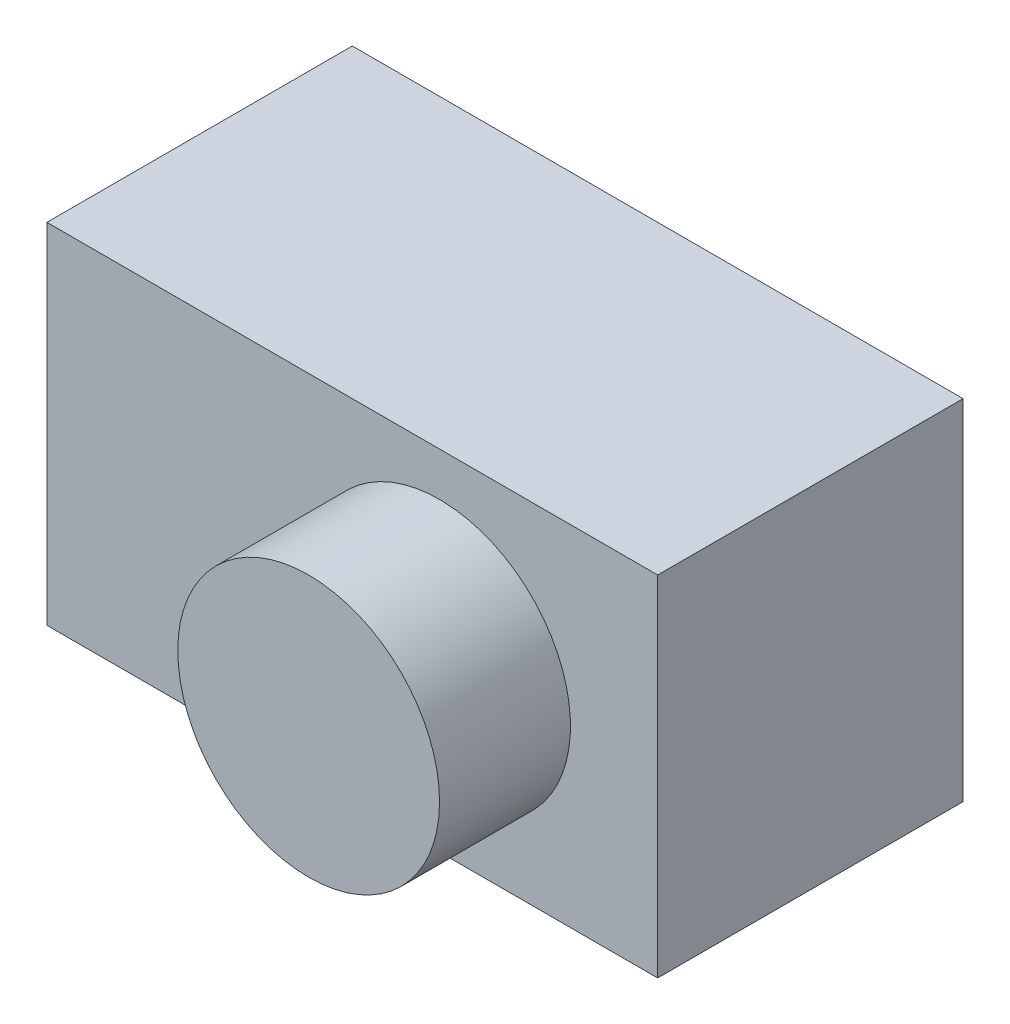
ISO-10303-21;
HEADER;
FILE_DESCRIPTION(('STEP AP214'),'2;1');
FILE_NAME('part.step','',(''),(''),'','','');
FILE_SCHEMA(('AUTOMOTIVE_DESIGN { 1 0 10303 214 1 1 1 1 }'));
ENDSEC;
DATA;
#1=APPLICATION_CONTEXT('core data for automotive mechanical design processes');
#2=APPLICATION_PROTOCOL_DEFINITION('international standard','automotive_design',2000,#1);
#3=PRODUCT_CONTEXT('',#1,'mechanical');
#4=PRODUCT('Part','Part','',(#3));
#5=PRODUCT_RELATED_PRODUCT_CATEGORY('part','',(#4));
#6=PRODUCT_DEFINITION_FORMATION('','',#4);
#7=PRODUCT_DEFINITION_CONTEXT('part definition',#1,'design');
#8=PRODUCT_DEFINITION('design','',#6,#7);
#9=PRODUCT_DEFINITION_SHAPE('','',#8);
#10=(LENGTH_UNIT() NAMED_UNIT(*) SI_UNIT(.MILLI.,.METRE.));
#11=(NAMED_UNIT(*) PLANE_ANGLE_UNIT() SI_UNIT($,.RADIAN.));
#12=(NAMED_UNIT(*) SI_UNIT($,.STERADIAN.) SOLID_ANGLE_UNIT());
#13=UNCERTAINTY_MEASURE_WITH_UNIT(LENGTH_MEASURE(1.E-05),#10,'distance_accuracy_value','');
#14=(GEOMETRIC_REPRESENTATION_CONTEXT(3) GLOBAL_UNCERTAINTY_ASSIGNED_CONTEXT((#13)) GLOBAL_UNIT_ASSIGNED_CONTEXT((#10,
#11,#12)) REPRESENTATION_CONTEXT('',''));
#15=CARTESIAN_POINT('',(0.,0.,0.));
#16=DIRECTION('',(0.,0.,1.));
#17=DIRECTION('',(1.,0.,0.));
#18=AXIS2_PLACEMENT_3D('',#15,#16,#17);
#19=CARTESIAN_POINT('',(0.,0.,70.));
#20=DIRECTION('',(1.,0.,0.));
#21=DIRECTION('',(0.,0.,-1.));
#22=AXIS2_PLACEMENT_3D('',#19,#20,#21);
#23=PLANE('',#22);
#24=DIRECTION('',(0.,-1.,0.));
#25=VECTOR('',#24,1.);
#26=CARTESIAN_POINT('',(0.,0.,0.));
#27=LINE('',#26,#25);
#28=CARTESIAN_POINT('',(0.,80.,0.));
#29=VERTEX_POINT('',#28);
#30=CARTESIAN_POINT('',(0.,0.,0.));
#31=VERTEX_POINT('',#30);
#32=EDGE_CURVE('E122',#29,#31,#27,.T.);
#33=ORIENTED_EDGE('',*,*,#32,.T.);
#34=DIRECTION('',(0.,0.,-1.));
#35=VECTOR('',#34,1.);
#36=CARTESIAN_POINT('',(0.,0.,70.));
#37=LINE('',#36,#35);
#38=CARTESIAN_POINT('',(0.,0.,70.));
#39=VERTEX_POINT('',#38);
#40=EDGE_CURVE('E60',#39,#31,#37,.T.);
#41=ORIENTED_EDGE('',*,*,#40,.F.);
#42=DIRECTION('',(0.,-1.,0.));
#43=VECTOR('',#42,1.);
#44=CARTESIAN_POINT('',(0.,0.,70.));
#45=LINE('',#44,#43);
#46=CARTESIAN_POINT('',(0.,80.,70.));
#47=VERTEX_POINT('',#46);
#48=EDGE_CURVE('E104',#47,#39,#45,.T.);
#49=ORIENTED_EDGE('',*,*,#48,.F.);
#50=DIRECTION('',(0.,0.,-1.));
#51=VECTOR('',#50,1.);
#52=CARTESIAN_POINT('',(0.,80.,70.));
#53=LINE('',#52,#51);
#54=EDGE_CURVE('E118',#47,#29,#53,.T.);
#55=ORIENTED_EDGE('',*,*,#54,.T.);
#56=EDGE_LOOP('',(#33,#41,#49,#55));
#57=FACE_BOUND('',#56,.T.);
#58=ADVANCED_FACE('F51',(#57),#23,.F.);
#59=CARTESIAN_POINT('',(0.,0.,70.));
#60=DIRECTION('',(0.,1.,0.));
#61=DIRECTION('',(0.,0.,1.));
#62=AXIS2_PLACEMENT_3D('',#59,#60,#61);
#63=PLANE('',#62);
#64=DIRECTION('',(1.,0.,0.));
#65=VECTOR('',#64,1.);
#66=CARTESIAN_POINT('',(0.,0.,0.));
#67=LINE('',#66,#65);
#68=CARTESIAN_POINT('',(140.,0.,0.));
#69=VERTEX_POINT('',#68);
#70=EDGE_CURVE('E110',#31,#69,#67,.T.);
#71=ORIENTED_EDGE('',*,*,#70,.T.);
#72=DIRECTION('',(0.,0.,-1.));
#73=VECTOR('',#72,1.);
#74=CARTESIAN_POINT('',(140.,0.,70.));
#75=LINE('',#74,#73);
#76=CARTESIAN_POINT('',(140.,0.,70.));
#77=VERTEX_POINT('',#76);
#78=EDGE_CURVE('E108',#77,#69,#75,.T.);
#79=ORIENTED_EDGE('',*,*,#78,.F.);
#80=DIRECTION('',(1.,0.,0.));
#81=VECTOR('',#80,1.);
#82=CARTESIAN_POINT('',(0.,0.,70.));
#83=LINE('',#82,#81);
#84=EDGE_CURVE('E99',#39,#77,#83,.T.);
#85=ORIENTED_EDGE('',*,*,#84,.F.);
#86=ORIENTED_EDGE('',*,*,#40,.T.);
#87=EDGE_LOOP('',(#71,#79,#85,#86));
#88=FACE_BOUND('',#87,.T.);
#89=ADVANCED_FACE('F109',(#88),#63,.F.);
#90=CARTESIAN_POINT('',(140.,0.,70.));
#91=DIRECTION('',(-1.,0.,0.));
#92=DIRECTION('',(0.,0.,1.));
#93=AXIS2_PLACEMENT_3D('',#90,#91,#92);
#94=PLANE('',#93);
#95=DIRECTION('',(0.,1.,0.));
#96=VECTOR('',#95,1.);
#97=CARTESIAN_POINT('',(140.,0.,0.));
#98=LINE('',#97,#96);
#99=CARTESIAN_POINT('',(140.,80.,0.));
#100=VERTEX_POINT('',#99);
#101=EDGE_CURVE('E85',#69,#100,#98,.T.);
#102=ORIENTED_EDGE('',*,*,#101,.T.);
#103=DIRECTION('',(0.,0.,-1.));
#104=VECTOR('',#103,1.);
#105=CARTESIAN_POINT('',(140.,80.,70.));
#106=LINE('',#105,#104);
#107=CARTESIAN_POINT('',(140.,80.,70.));
#108=VERTEX_POINT('',#107);
#109=EDGE_CURVE('E112',#108,#100,#106,.T.);
#110=ORIENTED_EDGE('',*,*,#109,.F.);
#111=DIRECTION('',(0.,1.,0.));
#112=VECTOR('',#111,1.);
#113=CARTESIAN_POINT('',(140.,0.,70.));
#114=LINE('',#113,#112);
#115=EDGE_CURVE('E102',#77,#108,#114,.T.);
#116=ORIENTED_EDGE('',*,*,#115,.F.);
#117=ORIENTED_EDGE('',*,*,#78,.T.);
#118=EDGE_LOOP('',(#102,#110,#116,#117));
#119=FACE_BOUND('',#118,.T.);
#120=ADVANCED_FACE('F114',(#119),#94,.F.);
#121=CARTESIAN_POINT('',(0.,80.,70.));
#122=DIRECTION('',(0.,-1.,0.));
#123=DIRECTION('',(0.,0.,-1.));
#124=AXIS2_PLACEMENT_3D('',#121,#122,#123);
#125=PLANE('',#124);
#126=DIRECTION('',(-1.,0.,0.));
#127=VECTOR('',#126,1.);
#128=CARTESIAN_POINT('',(0.,80.,0.));
#129=LINE('',#128,#127);
#130=EDGE_CURVE('E91',#100,#29,#129,.T.);
#131=ORIENTED_EDGE('',*,*,#130,.T.);
#132=ORIENTED_EDGE('',*,*,#54,.F.);
#133=DIRECTION('',(-1.,0.,0.));
#134=VECTOR('',#133,1.);
#135=CARTESIAN_POINT('',(0.,80.,70.));
#136=LINE('',#135,#134);
#137=EDGE_CURVE('E68',#108,#47,#136,.T.);
#138=ORIENTED_EDGE('',*,*,#137,.F.);
#139=ORIENTED_EDGE('',*,*,#109,.T.);
#140=EDGE_LOOP('',(#131,#132,#138,#139));
#141=FACE_BOUND('',#140,.T.);
#142=ADVANCED_FACE('F151',(#141),#125,.F.);
#143=CARTESIAN_POINT('',(0.,0.,70.));
#144=DIRECTION('',(0.,0.,-1.));
#145=DIRECTION('',(-1.,0.,0.));
#146=AXIS2_PLACEMENT_3D('',#143,#144,#145);
#147=PLANE('',#146);
#148=CARTESIAN_POINT('',(90.,40.,70.));
#149=DIRECTION('',(0.,0.,-1.));
#150=DIRECTION('',(-1.,0.,0.));
#151=AXIS2_PLACEMENT_3D('',#148,#149,#150);
#152=CIRCLE('',#151,30.);
#153=CARTESIAN_POINT('',(60.,40.,70.));
#154=VERTEX_POINT('',#153);
#155=EDGE_CURVE('E11',#154,#154,#152,.F.);
#156=ORIENTED_EDGE('',*,*,#155,.F.);
#157=EDGE_LOOP('',(#156));
#158=FACE_BOUND('',#157,.T.);
#159=ORIENTED_EDGE('',*,*,#48,.T.);
#160=ORIENTED_EDGE('',*,*,#84,.T.);
#161=ORIENTED_EDGE('',*,*,#115,.T.);
#162=ORIENTED_EDGE('',*,*,#137,.T.);
#163=EDGE_LOOP('',(#159,#160,#161,#162));
#164=FACE_BOUND('',#163,.T.);
#165=ADVANCED_FACE('F100',(#158,#164),#147,.F.);
#166=CARTESIAN_POINT('',(0.,0.,0.));
#167=DIRECTION('',(0.,0.,-1.));
#168=DIRECTION('',(-1.,0.,0.));
#169=AXIS2_PLACEMENT_3D('',#166,#167,#168);
#170=PLANE('',#169);
#171=ORIENTED_EDGE('',*,*,#32,.F.);
#172=ORIENTED_EDGE('',*,*,#130,.F.);
#173=ORIENTED_EDGE('',*,*,#101,.F.);
#174=ORIENTED_EDGE('',*,*,#70,.F.);
#175=EDGE_LOOP('',(#171,#172,#173,#174));
#176=FACE_BOUND('',#175,.T.);
#177=ADVANCED_FACE('F140',(#176),#170,.T.);
#178=CARTESIAN_POINT('',(90.,40.,100.));
#179=DIRECTION('',(0.,0.,-1.));
#180=DIRECTION('',(-1.,0.,0.));
#181=AXIS2_PLACEMENT_3D('',#178,#179,#180);
#182=CYLINDRICAL_SURFACE('',#181,30.);
#183=CARTESIAN_POINT('',(90.,40.,100.));
#184=DIRECTION('',(0.,0.,1.));
#185=DIRECTION('',(1.,0.,0.));
#186=AXIS2_PLACEMENT_3D('',#183,#184,#185);
#187=CIRCLE('',#186,30.);
#188=CARTESIAN_POINT('',(120.,40.,100.));
#189=VERTEX_POINT('',#188);
#190=EDGE_CURVE('E126',#189,#189,#187,.T.);
#191=ORIENTED_EDGE('',*,*,#190,.F.);
#192=EDGE_LOOP('',(#191));
#193=FACE_BOUND('',#192,.T.);
#194=ORIENTED_EDGE('',*,*,#155,.T.);
#195=EDGE_LOOP('',(#194));
#196=FACE_BOUND('',#195,.T.);
#197=ADVANCED_FACE('F142',(#193,#196),#182,.T.);
#198=CARTESIAN_POINT('',(90.,40.,100.));
#199=DIRECTION('',(0.,0.,1.));
#200=DIRECTION('',(1.,0.,0.));
#201=AXIS2_PLACEMENT_3D('',#198,#199,#200);
#202=PLANE('',#201);
#203=ORIENTED_EDGE('',*,*,#190,.T.);
#204=EDGE_LOOP('',(#203));
#205=FACE_BOUND('',#204,.T.);
#206=ADVANCED_FACE('F148',(#205),#202,.T.);
#207=CLOSED_SHELL('',(#58,#89,#120,#142,#165,#177,#197,#206));
#208=MANIFOLD_SOLID_BREP('B2',#207);
#209=ADVANCED_BREP_SHAPE_REPRESENTATION('',(#18,#208),#14);
#210=SHAPE_DEFINITION_REPRESENTATION(#9,#209);
ENDSEC;
END-ISO-10303-21;
